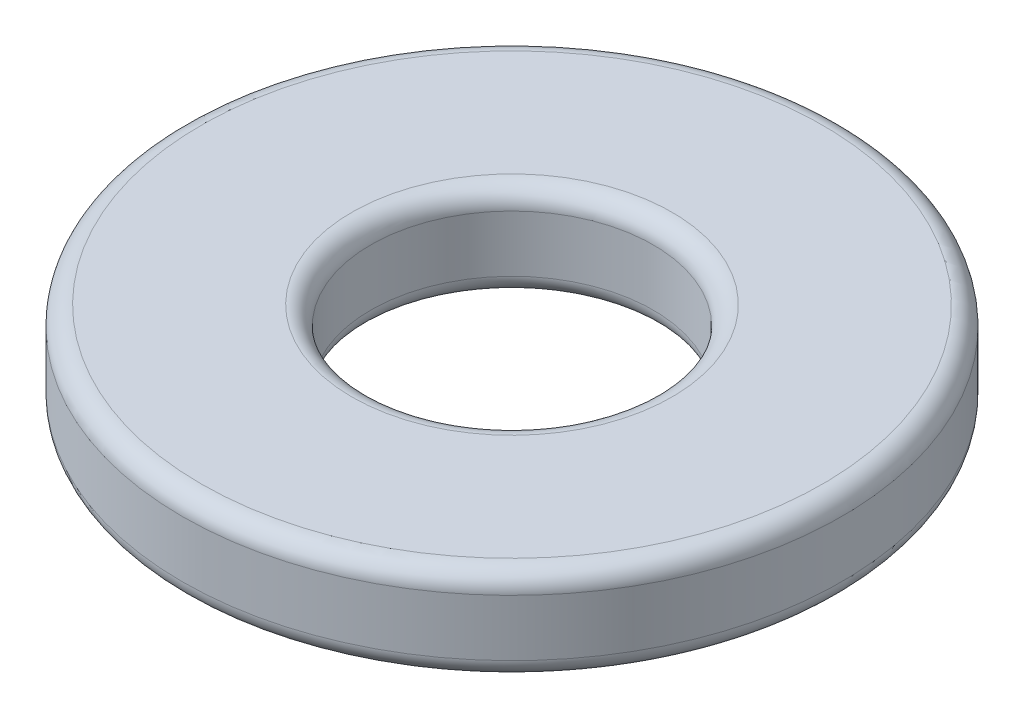
ISO-10303-21;
HEADER;
FILE_DESCRIPTION(('STEP AP214'),'2;1');
FILE_NAME('part.step','',(''),(''),'','','');
FILE_SCHEMA(('AUTOMOTIVE_DESIGN { 1 0 10303 214 1 1 1 1 }'));
ENDSEC;
DATA;
#1=APPLICATION_CONTEXT('core data for automotive mechanical design processes');
#2=APPLICATION_PROTOCOL_DEFINITION('international standard','automotive_design',2000,#1);
#3=PRODUCT_CONTEXT('',#1,'mechanical');
#4=PRODUCT('Part','Part','',(#3));
#5=PRODUCT_RELATED_PRODUCT_CATEGORY('part','',(#4));
#6=PRODUCT_DEFINITION_FORMATION('','',#4);
#7=PRODUCT_DEFINITION_CONTEXT('part definition',#1,'design');
#8=PRODUCT_DEFINITION('design','',#6,#7);
#9=PRODUCT_DEFINITION_SHAPE('','',#8);
#10=(LENGTH_UNIT() NAMED_UNIT(*) SI_UNIT(.MILLI.,.METRE.));
#11=(NAMED_UNIT(*) PLANE_ANGLE_UNIT() SI_UNIT($,.RADIAN.));
#12=(NAMED_UNIT(*) SI_UNIT($,.STERADIAN.) SOLID_ANGLE_UNIT());
#13=UNCERTAINTY_MEASURE_WITH_UNIT(LENGTH_MEASURE(1.E-05),#10,'distance_accuracy_value','');
#14=(GEOMETRIC_REPRESENTATION_CONTEXT(3) GLOBAL_UNCERTAINTY_ASSIGNED_CONTEXT((#13)) GLOBAL_UNIT_ASSIGNED_CONTEXT((#10,
#11,#12)) REPRESENTATION_CONTEXT('',''));
#15=CARTESIAN_POINT('',(0.,0.,0.));
#16=DIRECTION('',(0.,0.,1.));
#17=DIRECTION('',(1.,0.,0.));
#18=AXIS2_PLACEMENT_3D('',#15,#16,#17);
#19=CARTESIAN_POINT('',(0.,1.,0.));
#20=DIRECTION('',(0.,1.,0.));
#21=DIRECTION('',(0.,0.,1.));
#22=AXIS2_PLACEMENT_3D('',#19,#20,#21);
#23=PLANE('',#22);
#24=CARTESIAN_POINT('',(0.,1.,0.));
#25=DIRECTION('',(0.,1.,0.));
#26=DIRECTION('',(0.,0.,1.));
#27=AXIS2_PLACEMENT_3D('',#24,#25,#26);
#28=CIRCLE('',#27,3.3);
#29=CARTESIAN_POINT('',(0.,1.,3.3));
#30=VERTEX_POINT('',#29);
#31=EDGE_CURVE('E57',#30,#30,#28,.T.);
#32=ORIENTED_EDGE('',*,*,#31,.T.);
#33=EDGE_LOOP('',(#32));
#34=FACE_BOUND('',#33,.T.);
#35=CARTESIAN_POINT('',(0.,1.,0.));
#36=DIRECTION('',(0.,1.,0.));
#37=DIRECTION('',(0.,0.,1.));
#38=AXIS2_PLACEMENT_3D('',#35,#36,#37);
#39=CIRCLE('',#38,1.7);
#40=CARTESIAN_POINT('',(0.,1.,1.7));
#41=VERTEX_POINT('',#40);
#42=EDGE_CURVE('E60',#41,#41,#39,.F.);
#43=ORIENTED_EDGE('',*,*,#42,.T.);
#44=EDGE_LOOP('',(#43));
#45=FACE_BOUND('',#44,.T.);
#46=ADVANCED_FACE('F31',(#34,#45),#23,.T.);
#47=CARTESIAN_POINT('',(0.,0.,0.));
#48=DIRECTION('',(0.,1.,0.));
#49=DIRECTION('',(0.,0.,1.));
#50=AXIS2_PLACEMENT_3D('',#47,#48,#49);
#51=PLANE('',#50);
#52=CARTESIAN_POINT('',(0.,0.,0.));
#53=DIRECTION('',(0.,1.,0.));
#54=DIRECTION('',(0.,0.,1.));
#55=AXIS2_PLACEMENT_3D('',#52,#53,#54);
#56=CIRCLE('',#55,3.3);
#57=CARTESIAN_POINT('',(0.,0.,3.3));
#58=VERTEX_POINT('',#57);
#59=EDGE_CURVE('E42',#58,#58,#56,.F.);
#60=ORIENTED_EDGE('',*,*,#59,.T.);
#61=EDGE_LOOP('',(#60));
#62=FACE_BOUND('',#61,.T.);
#63=CARTESIAN_POINT('',(0.,0.,0.));
#64=DIRECTION('',(0.,1.,0.));
#65=DIRECTION('',(0.,0.,1.));
#66=AXIS2_PLACEMENT_3D('',#63,#64,#65);
#67=CIRCLE('',#66,1.7);
#68=CARTESIAN_POINT('',(0.,0.,1.7));
#69=VERTEX_POINT('',#68);
#70=EDGE_CURVE('E46',#69,#69,#67,.T.);
#71=ORIENTED_EDGE('',*,*,#70,.T.);
#72=EDGE_LOOP('',(#71));
#73=FACE_BOUND('',#72,.T.);
#74=ADVANCED_FACE('F74',(#62,#73),#51,.F.);
#75=CARTESIAN_POINT('',(0.,1.,0.));
#76=DIRECTION('',(0.,-1.,0.));
#77=DIRECTION('',(0.,0.,-1.));
#78=AXIS2_PLACEMENT_3D('',#75,#76,#77);
#79=CYLINDRICAL_SURFACE('',#78,3.5);
#80=CARTESIAN_POINT('',(0.,0.8,0.));
#81=DIRECTION('',(0.,1.,0.));
#82=DIRECTION('',(0.,0.,1.));
#83=AXIS2_PLACEMENT_3D('',#80,#81,#82);
#84=CIRCLE('',#83,3.5);
#85=CARTESIAN_POINT('',(0.,0.8,3.5));
#86=VERTEX_POINT('',#85);
#87=EDGE_CURVE('E51',#86,#86,#84,.F.);
#88=ORIENTED_EDGE('',*,*,#87,.T.);
#89=EDGE_LOOP('',(#88));
#90=FACE_BOUND('',#89,.T.);
#91=CARTESIAN_POINT('',(0.,0.2,0.));
#92=DIRECTION('',(0.,1.,0.));
#93=DIRECTION('',(0.,0.,1.));
#94=AXIS2_PLACEMENT_3D('',#91,#92,#93);
#95=CIRCLE('',#94,3.5);
#96=CARTESIAN_POINT('',(0.,0.2,3.5));
#97=VERTEX_POINT('',#96);
#98=EDGE_CURVE('E54',#97,#97,#95,.T.);
#99=ORIENTED_EDGE('',*,*,#98,.T.);
#100=EDGE_LOOP('',(#99));
#101=FACE_BOUND('',#100,.T.);
#102=ADVANCED_FACE('F80',(#90,#101),#79,.T.);
#103=CARTESIAN_POINT('',(0.,1.,0.));
#104=DIRECTION('',(0.,-1.,0.));
#105=DIRECTION('',(0.,0.,-1.));
#106=AXIS2_PLACEMENT_3D('',#103,#104,#105);
#107=CYLINDRICAL_SURFACE('',#106,1.5);
#108=CARTESIAN_POINT('',(0.,0.2,0.));
#109=DIRECTION('',(0.,1.,0.));
#110=DIRECTION('',(0.,0.,1.));
#111=AXIS2_PLACEMENT_3D('',#108,#109,#110);
#112=CIRCLE('',#111,1.5);
#113=CARTESIAN_POINT('',(0.,0.2,1.5));
#114=VERTEX_POINT('',#113);
#115=EDGE_CURVE('E10',#114,#114,#112,.F.);
#116=ORIENTED_EDGE('',*,*,#115,.T.);
#117=EDGE_LOOP('',(#116));
#118=FACE_BOUND('',#117,.T.);
#119=CARTESIAN_POINT('',(0.,0.8,0.));
#120=DIRECTION('',(0.,1.,0.));
#121=DIRECTION('',(0.,0.,1.));
#122=AXIS2_PLACEMENT_3D('',#119,#120,#121);
#123=CIRCLE('',#122,1.5);
#124=CARTESIAN_POINT('',(0.,0.8,1.5));
#125=VERTEX_POINT('',#124);
#126=EDGE_CURVE('E38',#125,#125,#123,.T.);
#127=ORIENTED_EDGE('',*,*,#126,.T.);
#128=EDGE_LOOP('',(#127));
#129=FACE_BOUND('',#128,.T.);
#130=ADVANCED_FACE('F84',(#118,#129),#107,.F.);
#131=CARTESIAN_POINT('',(0.,0.8,0.));
#132=DIRECTION('',(0.,1.,0.));
#133=DIRECTION('',(0.,0.,1.));
#134=AXIS2_PLACEMENT_3D('',#131,#132,#133);
#135=TOROIDAL_SURFACE('',#134,3.3,0.2);
#136=ORIENTED_EDGE('',*,*,#87,.F.);
#137=EDGE_LOOP('',(#136));
#138=FACE_BOUND('',#137,.T.);
#139=ORIENTED_EDGE('',*,*,#31,.F.);
#140=EDGE_LOOP('',(#139));
#141=FACE_BOUND('',#140,.T.);
#142=ADVANCED_FACE('F89',(#138,#141),#135,.T.);
#143=CARTESIAN_POINT('',(0.,0.2,0.));
#144=DIRECTION('',(0.,1.,0.));
#145=DIRECTION('',(0.,0.,1.));
#146=AXIS2_PLACEMENT_3D('',#143,#144,#145);
#147=TOROIDAL_SURFACE('',#146,3.3,0.2);
#148=ORIENTED_EDGE('',*,*,#59,.F.);
#149=EDGE_LOOP('',(#148));
#150=FACE_BOUND('',#149,.T.);
#151=ORIENTED_EDGE('',*,*,#98,.F.);
#152=EDGE_LOOP('',(#151));
#153=FACE_BOUND('',#152,.T.);
#154=ADVANCED_FACE('F71',(#150,#153),#147,.T.);
#155=CARTESIAN_POINT('',(0.,0.2,0.));
#156=DIRECTION('',(0.,1.,0.));
#157=DIRECTION('',(0.,0.,1.));
#158=AXIS2_PLACEMENT_3D('',#155,#156,#157);
#159=TOROIDAL_SURFACE('',#158,1.7,0.2);
#160=ORIENTED_EDGE('',*,*,#115,.F.);
#161=EDGE_LOOP('',(#160));
#162=FACE_BOUND('',#161,.T.);
#163=ORIENTED_EDGE('',*,*,#70,.F.);
#164=EDGE_LOOP('',(#163));
#165=FACE_BOUND('',#164,.T.);
#166=ADVANCED_FACE('F67',(#162,#165),#159,.T.);
#167=CARTESIAN_POINT('',(0.,0.8,0.));
#168=DIRECTION('',(0.,1.,0.));
#169=DIRECTION('',(0.,0.,1.));
#170=AXIS2_PLACEMENT_3D('',#167,#168,#169);
#171=TOROIDAL_SURFACE('',#170,1.7,0.2);
#172=ORIENTED_EDGE('',*,*,#42,.F.);
#173=EDGE_LOOP('',(#172));
#174=FACE_BOUND('',#173,.T.);
#175=ORIENTED_EDGE('',*,*,#126,.F.);
#176=EDGE_LOOP('',(#175));
#177=FACE_BOUND('',#176,.T.);
#178=ADVANCED_FACE('F33',(#174,#177),#171,.T.);
#179=CLOSED_SHELL('',(#46,#74,#102,#130,#142,#154,#166,#178));
#180=MANIFOLD_SOLID_BREP('B2',#179);
#181=ADVANCED_BREP_SHAPE_REPRESENTATION('',(#18,#180),#14);
#182=SHAPE_DEFINITION_REPRESENTATION(#9,#181);
ENDSEC;
END-ISO-10303-21;
